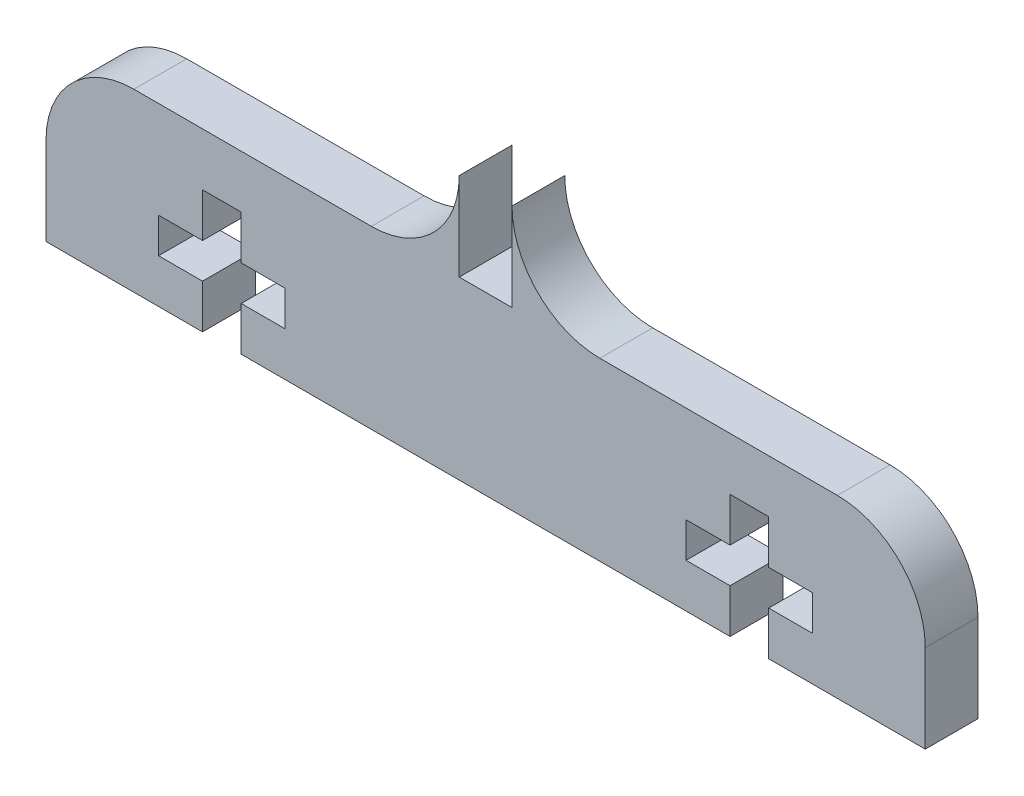
ISO-10303-21;
HEADER;
FILE_DESCRIPTION(('STEP AP214'),'2;1');
FILE_NAME('part.step','',(''),(''),'','','');
FILE_SCHEMA(('AUTOMOTIVE_DESIGN { 1 0 10303 214 1 1 1 1 }'));
ENDSEC;
DATA;
#1=APPLICATION_CONTEXT('core data for automotive mechanical design processes');
#2=APPLICATION_PROTOCOL_DEFINITION('international standard','automotive_design',2000,#1);
#3=PRODUCT_CONTEXT('',#1,'mechanical');
#4=PRODUCT('Part','Part','',(#3));
#5=PRODUCT_RELATED_PRODUCT_CATEGORY('part','',(#4));
#6=PRODUCT_DEFINITION_FORMATION('','',#4);
#7=PRODUCT_DEFINITION_CONTEXT('part definition',#1,'design');
#8=PRODUCT_DEFINITION('design','',#6,#7);
#9=PRODUCT_DEFINITION_SHAPE('','',#8);
#10=(LENGTH_UNIT() NAMED_UNIT(*) SI_UNIT(.MILLI.,.METRE.));
#11=(NAMED_UNIT(*) PLANE_ANGLE_UNIT() SI_UNIT($,.RADIAN.));
#12=(NAMED_UNIT(*) SI_UNIT($,.STERADIAN.) SOLID_ANGLE_UNIT());
#13=UNCERTAINTY_MEASURE_WITH_UNIT(LENGTH_MEASURE(1.E-05),#10,'distance_accuracy_value','');
#14=(GEOMETRIC_REPRESENTATION_CONTEXT(3) GLOBAL_UNCERTAINTY_ASSIGNED_CONTEXT((#13)) GLOBAL_UNIT_ASSIGNED_CONTEXT((#10,
#11,#12)) REPRESENTATION_CONTEXT('',''));
#15=CARTESIAN_POINT('',(0.,0.,0.));
#16=DIRECTION('',(0.,0.,1.));
#17=DIRECTION('',(1.,0.,0.));
#18=AXIS2_PLACEMENT_3D('',#15,#16,#17);
#19=CARTESIAN_POINT('',(6.49999999999999,5.,3.));
#20=DIRECTION('',(0.,-1.,0.));
#21=DIRECTION('',(1.,0.,0.));
#22=AXIS2_PLACEMENT_3D('',#19,#20,#21);
#23=PLANE('',#22);
#24=DIRECTION('',(-1.,0.,0.));
#25=VECTOR('',#24,1.);
#26=CARTESIAN_POINT('',(6.49999999999999,5.,3.));
#27=LINE('',#26,#25);
#28=CARTESIAN_POINT('',(20.,5.,3.));
#29=VERTEX_POINT('',#28);
#30=CARTESIAN_POINT('',(6.49999999999999,5.,3.));
#31=VERTEX_POINT('',#30);
#32=EDGE_CURVE('E264',#29,#31,#27,.T.);
#33=ORIENTED_EDGE('',*,*,#32,.F.);
#34=DIRECTION('',(0.,0.,-1.));
#35=VECTOR('',#34,1.);
#36=CARTESIAN_POINT('',(20.,5.,3.));
#37=LINE('',#36,#35);
#38=CARTESIAN_POINT('',(20.,5.,0.));
#39=VERTEX_POINT('',#38);
#40=EDGE_CURVE('E290',#29,#39,#37,.T.);
#41=ORIENTED_EDGE('',*,*,#40,.T.);
#42=DIRECTION('',(-1.,0.,0.));
#43=VECTOR('',#42,1.);
#44=CARTESIAN_POINT('',(6.49999999999999,5.,0.));
#45=LINE('',#44,#43);
#46=CARTESIAN_POINT('',(6.49999999999999,5.,0.));
#47=VERTEX_POINT('',#46);
#48=EDGE_CURVE('E288',#39,#47,#45,.T.);
#49=ORIENTED_EDGE('',*,*,#48,.T.);
#50=DIRECTION('',(0.,0.,-1.));
#51=VECTOR('',#50,1.);
#52=CARTESIAN_POINT('',(6.49999999999999,5.,3.));
#53=LINE('',#52,#51);
#54=EDGE_CURVE('E281',#31,#47,#53,.T.);
#55=ORIENTED_EDGE('',*,*,#54,.F.);
#56=EDGE_LOOP('',(#33,#41,#49,#55));
#57=FACE_BOUND('',#56,.T.);
#58=ADVANCED_FACE('F33',(#57),#23,.F.);
#59=CARTESIAN_POINT('',(6.49999999999999,10.,3.));
#60=DIRECTION('',(0.,0.,-1.));
#61=DIRECTION('',(-1.,0.,0.));
#62=AXIS2_PLACEMENT_3D('',#59,#60,#61);
#63=CYLINDRICAL_SURFACE('',#62,5.);
#64=CARTESIAN_POINT('',(6.49999999999999,10.,0.));
#65=DIRECTION('',(0.,0.,-1.));
#66=DIRECTION('',(1.,0.,0.));
#67=AXIS2_PLACEMENT_3D('',#64,#65,#66);
#68=CIRCLE('',#67,5.);
#69=CARTESIAN_POINT('',(1.49999999999999,10.,0.));
#70=VERTEX_POINT('',#69);
#71=EDGE_CURVE('E480',#47,#70,#68,.T.);
#72=ORIENTED_EDGE('',*,*,#71,.T.);
#73=DIRECTION('',(0.,0.,-1.));
#74=VECTOR('',#73,1.);
#75=CARTESIAN_POINT('',(1.49999999999999,10.,3.));
#76=LINE('',#75,#74);
#77=CARTESIAN_POINT('',(1.49999999999999,10.,3.));
#78=VERTEX_POINT('',#77);
#79=EDGE_CURVE('E283',#78,#70,#76,.T.);
#80=ORIENTED_EDGE('',*,*,#79,.F.);
#81=CARTESIAN_POINT('',(6.49999999999999,10.,3.));
#82=DIRECTION('',(0.,0.,-1.));
#83=DIRECTION('',(1.,0.,0.));
#84=AXIS2_PLACEMENT_3D('',#81,#82,#83);
#85=CIRCLE('',#84,5.);
#86=EDGE_CURVE('E268',#31,#78,#85,.T.);
#87=ORIENTED_EDGE('',*,*,#86,.F.);
#88=ORIENTED_EDGE('',*,*,#54,.T.);
#89=EDGE_LOOP('',(#72,#80,#87,#88));
#90=FACE_BOUND('',#89,.T.);
#91=ADVANCED_FACE('F280',(#90),#63,.F.);
#92=CARTESIAN_POINT('',(1.49999999999999,10.,3.));
#93=DIRECTION('',(1.,0.,0.));
#94=DIRECTION('',(0.,1.,0.));
#95=AXIS2_PLACEMENT_3D('',#92,#93,#94);
#96=PLANE('',#95);
#97=DIRECTION('',(0.,-1.,0.));
#98=VECTOR('',#97,1.);
#99=CARTESIAN_POINT('',(1.49999999999999,10.,0.));
#100=LINE('',#99,#98);
#101=CARTESIAN_POINT('',(1.49999999999999,5.,0.));
#102=VERTEX_POINT('',#101);
#103=EDGE_CURVE('E475',#70,#102,#100,.T.);
#104=ORIENTED_EDGE('',*,*,#103,.T.);
#105=DIRECTION('',(0.,0.,-1.));
#106=VECTOR('',#105,1.);
#107=CARTESIAN_POINT('',(1.49999999999999,5.,3.));
#108=LINE('',#107,#106);
#109=CARTESIAN_POINT('',(1.49999999999999,5.,3.));
#110=VERTEX_POINT('',#109);
#111=EDGE_CURVE('E294',#110,#102,#108,.T.);
#112=ORIENTED_EDGE('',*,*,#111,.F.);
#113=DIRECTION('',(0.,-1.,0.));
#114=VECTOR('',#113,1.);
#115=CARTESIAN_POINT('',(1.49999999999999,10.,3.));
#116=LINE('',#115,#114);
#117=EDGE_CURVE('E285',#78,#110,#116,.T.);
#118=ORIENTED_EDGE('',*,*,#117,.F.);
#119=ORIENTED_EDGE('',*,*,#79,.T.);
#120=EDGE_LOOP('',(#104,#112,#118,#119));
#121=FACE_BOUND('',#120,.T.);
#122=ADVANCED_FACE('F548',(#121),#96,.F.);
#123=CARTESIAN_POINT('',(-1.5,5.,3.));
#124=DIRECTION('',(0.,-1.,0.));
#125=DIRECTION('',(0.,0.,-1.));
#126=AXIS2_PLACEMENT_3D('',#123,#124,#125);
#127=PLANE('',#126);
#128=DIRECTION('',(-1.,0.,0.));
#129=VECTOR('',#128,1.);
#130=CARTESIAN_POINT('',(-1.5,5.,0.));
#131=LINE('',#130,#129);
#132=CARTESIAN_POINT('',(-1.5,5.,0.));
#133=VERTEX_POINT('',#132);
#134=EDGE_CURVE('E470',#102,#133,#131,.T.);
#135=ORIENTED_EDGE('',*,*,#134,.T.);
#136=DIRECTION('',(0.,0.,-1.));
#137=VECTOR('',#136,1.);
#138=CARTESIAN_POINT('',(-1.5,5.,3.));
#139=LINE('',#138,#137);
#140=CARTESIAN_POINT('',(-1.5,5.,3.));
#141=VERTEX_POINT('',#140);
#142=EDGE_CURVE('E461',#141,#133,#139,.T.);
#143=ORIENTED_EDGE('',*,*,#142,.F.);
#144=DIRECTION('',(-1.,0.,0.));
#145=VECTOR('',#144,1.);
#146=CARTESIAN_POINT('',(-1.5,5.,3.));
#147=LINE('',#146,#145);
#148=EDGE_CURVE('E471',#110,#141,#147,.T.);
#149=ORIENTED_EDGE('',*,*,#148,.F.);
#150=ORIENTED_EDGE('',*,*,#111,.T.);
#151=EDGE_LOOP('',(#135,#143,#149,#150));
#152=FACE_BOUND('',#151,.T.);
#153=ADVANCED_FACE('F468',(#152),#127,.F.);
#154=CARTESIAN_POINT('',(-1.5,10.,3.));
#155=DIRECTION('',(-1.,0.,0.));
#156=DIRECTION('',(0.,-1.,0.));
#157=AXIS2_PLACEMENT_3D('',#154,#155,#156);
#158=PLANE('',#157);
#159=DIRECTION('',(0.,1.,0.));
#160=VECTOR('',#159,1.);
#161=CARTESIAN_POINT('',(-1.5,10.,0.));
#162=LINE('',#161,#160);
#163=CARTESIAN_POINT('',(-1.5,10.,0.));
#164=VERTEX_POINT('',#163);
#165=EDGE_CURVE('E477',#133,#164,#162,.T.);
#166=ORIENTED_EDGE('',*,*,#165,.T.);
#167=DIRECTION('',(0.,0.,-1.));
#168=VECTOR('',#167,1.);
#169=CARTESIAN_POINT('',(-1.5,10.,3.));
#170=LINE('',#169,#168);
#171=CARTESIAN_POINT('',(-1.5,10.,3.));
#172=VERTEX_POINT('',#171);
#173=EDGE_CURVE('E458',#172,#164,#170,.T.);
#174=ORIENTED_EDGE('',*,*,#173,.F.);
#175=DIRECTION('',(0.,1.,0.));
#176=VECTOR('',#175,1.);
#177=CARTESIAN_POINT('',(-1.5,10.,3.));
#178=LINE('',#177,#176);
#179=EDGE_CURVE('E494',#141,#172,#178,.T.);
#180=ORIENTED_EDGE('',*,*,#179,.F.);
#181=ORIENTED_EDGE('',*,*,#142,.T.);
#182=EDGE_LOOP('',(#166,#174,#180,#181));
#183=FACE_BOUND('',#182,.T.);
#184=ADVANCED_FACE('F553',(#183),#158,.F.);
#185=CARTESIAN_POINT('',(-6.5,10.,3.));
#186=DIRECTION('',(0.,0.,-1.));
#187=DIRECTION('',(-1.,0.,0.));
#188=AXIS2_PLACEMENT_3D('',#185,#186,#187);
#189=CYLINDRICAL_SURFACE('',#188,5.);
#190=CARTESIAN_POINT('',(-6.5,10.,0.));
#191=DIRECTION('',(0.,0.,-1.));
#192=DIRECTION('',(-1.,0.,0.));
#193=AXIS2_PLACEMENT_3D('',#190,#191,#192);
#194=CIRCLE('',#193,5.);
#195=CARTESIAN_POINT('',(-6.5,5.,0.));
#196=VERTEX_POINT('',#195);
#197=EDGE_CURVE('E324',#164,#196,#194,.T.);
#198=ORIENTED_EDGE('',*,*,#197,.T.);
#199=DIRECTION('',(0.,0.,-1.));
#200=VECTOR('',#199,1.);
#201=CARTESIAN_POINT('',(-6.5,5.,3.));
#202=LINE('',#201,#200);
#203=CARTESIAN_POINT('',(-6.5,5.,3.));
#204=VERTEX_POINT('',#203);
#205=EDGE_CURVE('E455',#204,#196,#202,.T.);
#206=ORIENTED_EDGE('',*,*,#205,.F.);
#207=CARTESIAN_POINT('',(-6.5,10.,3.));
#208=DIRECTION('',(0.,0.,-1.));
#209=DIRECTION('',(-1.,0.,0.));
#210=AXIS2_PLACEMENT_3D('',#207,#208,#209);
#211=CIRCLE('',#210,5.);
#212=EDGE_CURVE('E490',#172,#204,#211,.T.);
#213=ORIENTED_EDGE('',*,*,#212,.F.);
#214=ORIENTED_EDGE('',*,*,#173,.T.);
#215=EDGE_LOOP('',(#198,#206,#213,#214));
#216=FACE_BOUND('',#215,.T.);
#217=ADVANCED_FACE('F485',(#216),#189,.F.);
#218=CARTESIAN_POINT('',(-25.,5.,3.));
#219=DIRECTION('',(0.,-1.,0.));
#220=DIRECTION('',(1.,0.,0.));
#221=AXIS2_PLACEMENT_3D('',#218,#219,#220);
#222=PLANE('',#221);
#223=DIRECTION('',(-1.,0.,0.));
#224=VECTOR('',#223,1.);
#225=CARTESIAN_POINT('',(-25.,5.,0.));
#226=LINE('',#225,#224);
#227=CARTESIAN_POINT('',(-20.,5.,0.));
#228=VERTEX_POINT('',#227);
#229=EDGE_CURVE('E320',#196,#228,#226,.T.);
#230=ORIENTED_EDGE('',*,*,#229,.T.);
#231=DIRECTION('',(0.,0.,-1.));
#232=VECTOR('',#231,1.);
#233=CARTESIAN_POINT('',(-20.,5.,3.));
#234=LINE('',#233,#232);
#235=CARTESIAN_POINT('',(-20.,5.,3.));
#236=VERTEX_POINT('',#235);
#237=EDGE_CURVE('E11',#228,#236,#234,.F.);
#238=ORIENTED_EDGE('',*,*,#237,.T.);
#239=DIRECTION('',(-1.,0.,0.));
#240=VECTOR('',#239,1.);
#241=CARTESIAN_POINT('',(-25.,5.,3.));
#242=LINE('',#241,#240);
#243=EDGE_CURVE('E489',#204,#236,#242,.T.);
#244=ORIENTED_EDGE('',*,*,#243,.F.);
#245=ORIENTED_EDGE('',*,*,#205,.T.);
#246=EDGE_LOOP('',(#230,#238,#244,#245));
#247=FACE_BOUND('',#246,.T.);
#248=ADVANCED_FACE('F488',(#247),#222,.F.);
#249=CARTESIAN_POINT('',(-25.,-5.,3.));
#250=DIRECTION('',(1.,0.,0.));
#251=DIRECTION('',(0.,0.,-1.));
#252=AXIS2_PLACEMENT_3D('',#249,#250,#251);
#253=PLANE('',#252);
#254=DIRECTION('',(0.,-1.,0.));
#255=VECTOR('',#254,1.);
#256=CARTESIAN_POINT('',(-25.,-5.,3.));
#257=LINE('',#256,#255);
#258=CARTESIAN_POINT('',(-25.,0.,3.));
#259=VERTEX_POINT('',#258);
#260=CARTESIAN_POINT('',(-25.,-5.,3.));
#261=VERTEX_POINT('',#260);
#262=EDGE_CURVE('E312',#259,#261,#257,.T.);
#263=ORIENTED_EDGE('',*,*,#262,.F.);
#264=DIRECTION('',(0.,0.,-1.));
#265=VECTOR('',#264,1.);
#266=CARTESIAN_POINT('',(-25.,0.,3.));
#267=LINE('',#266,#265);
#268=CARTESIAN_POINT('',(-25.,0.,0.));
#269=VERTEX_POINT('',#268);
#270=EDGE_CURVE('E41',#259,#269,#267,.T.);
#271=ORIENTED_EDGE('',*,*,#270,.T.);
#272=DIRECTION('',(0.,-1.,0.));
#273=VECTOR('',#272,1.);
#274=CARTESIAN_POINT('',(-25.,-5.,0.));
#275=LINE('',#274,#273);
#276=CARTESIAN_POINT('',(-25.,-5.,0.));
#277=VERTEX_POINT('',#276);
#278=EDGE_CURVE('E310',#269,#277,#275,.T.);
#279=ORIENTED_EDGE('',*,*,#278,.T.);
#280=DIRECTION('',(0.,0.,-1.));
#281=VECTOR('',#280,1.);
#282=CARTESIAN_POINT('',(-25.,-5.,3.));
#283=LINE('',#282,#281);
#284=EDGE_CURVE('E453',#261,#277,#283,.T.);
#285=ORIENTED_EDGE('',*,*,#284,.F.);
#286=EDGE_LOOP('',(#263,#271,#279,#285));
#287=FACE_BOUND('',#286,.T.);
#288=ADVANCED_FACE('F308',(#287),#253,.F.);
#289=CARTESIAN_POINT('',(-25.,-5.,3.));
#290=DIRECTION('',(0.,1.,0.));
#291=DIRECTION('',(0.,0.,1.));
#292=AXIS2_PLACEMENT_3D('',#289,#290,#291);
#293=PLANE('',#292);
#294=DIRECTION('',(1.,0.,0.));
#295=VECTOR('',#294,1.);
#296=CARTESIAN_POINT('',(-25.,-5.,0.));
#297=LINE('',#296,#295);
#298=CARTESIAN_POINT('',(-16.1,-5.,0.));
#299=VERTEX_POINT('',#298);
#300=EDGE_CURVE('E319',#277,#299,#297,.T.);
#301=ORIENTED_EDGE('',*,*,#300,.T.);
#302=DIRECTION('',(0.,0.,-1.));
#303=VECTOR('',#302,1.);
#304=CARTESIAN_POINT('',(-16.1,-5.,3.));
#305=LINE('',#304,#303);
#306=CARTESIAN_POINT('',(-16.1,-5.,3.));
#307=VERTEX_POINT('',#306);
#308=EDGE_CURVE('E450',#307,#299,#305,.T.);
#309=ORIENTED_EDGE('',*,*,#308,.F.);
#310=DIRECTION('',(1.,0.,0.));
#311=VECTOR('',#310,1.);
#312=CARTESIAN_POINT('',(-25.,-5.,3.));
#313=LINE('',#312,#311);
#314=EDGE_CURVE('E492',#261,#307,#313,.T.);
#315=ORIENTED_EDGE('',*,*,#314,.F.);
#316=ORIENTED_EDGE('',*,*,#284,.T.);
#317=EDGE_LOOP('',(#301,#309,#315,#316));
#318=FACE_BOUND('',#317,.T.);
#319=ADVANCED_FACE('F707',(#318),#293,.F.);
#320=CARTESIAN_POINT('',(-16.1,-5.,3.));
#321=DIRECTION('',(-1.,0.,0.));
#322=DIRECTION('',(0.,-1.,0.));
#323=AXIS2_PLACEMENT_3D('',#320,#321,#322);
#324=PLANE('',#323);
#325=DIRECTION('',(0.,1.,0.));
#326=VECTOR('',#325,1.);
#327=CARTESIAN_POINT('',(-16.1,-5.,0.));
#328=LINE('',#327,#326);
#329=CARTESIAN_POINT('',(-16.1,-2.5,0.));
#330=VERTEX_POINT('',#329);
#331=EDGE_CURVE('E322',#299,#330,#328,.T.);
#332=ORIENTED_EDGE('',*,*,#331,.T.);
#333=DIRECTION('',(0.,0.,-1.));
#334=VECTOR('',#333,1.);
#335=CARTESIAN_POINT('',(-16.1,-2.5,3.));
#336=LINE('',#335,#334);
#337=CARTESIAN_POINT('',(-16.1,-2.5,3.));
#338=VERTEX_POINT('',#337);
#339=EDGE_CURVE('E447',#338,#330,#336,.T.);
#340=ORIENTED_EDGE('',*,*,#339,.F.);
#341=DIRECTION('',(0.,1.,0.));
#342=VECTOR('',#341,1.);
#343=CARTESIAN_POINT('',(-16.1,-5.,3.));
#344=LINE('',#343,#342);
#345=EDGE_CURVE('E499',#307,#338,#344,.T.);
#346=ORIENTED_EDGE('',*,*,#345,.F.);
#347=ORIENTED_EDGE('',*,*,#308,.T.);
#348=EDGE_LOOP('',(#332,#340,#346,#347));
#349=FACE_BOUND('',#348,.T.);
#350=ADVANCED_FACE('F703',(#349),#324,.F.);
#351=CARTESIAN_POINT('',(-16.1,-2.5,3.));
#352=DIRECTION('',(0.,-1.,0.));
#353=DIRECTION('',(1.,0.,0.));
#354=AXIS2_PLACEMENT_3D('',#351,#352,#353);
#355=PLANE('',#354);
#356=DIRECTION('',(-1.,0.,0.));
#357=VECTOR('',#356,1.);
#358=CARTESIAN_POINT('',(-16.1,-2.5,0.));
#359=LINE('',#358,#357);
#360=CARTESIAN_POINT('',(-18.6,-2.5,0.));
#361=VERTEX_POINT('',#360);
#362=EDGE_CURVE('E329',#330,#361,#359,.T.);
#363=ORIENTED_EDGE('',*,*,#362,.T.);
#364=DIRECTION('',(0.,0.,-1.));
#365=VECTOR('',#364,1.);
#366=CARTESIAN_POINT('',(-18.6,-2.5,3.));
#367=LINE('',#366,#365);
#368=CARTESIAN_POINT('',(-18.6,-2.5,3.));
#369=VERTEX_POINT('',#368);
#370=EDGE_CURVE('E444',#369,#361,#367,.T.);
#371=ORIENTED_EDGE('',*,*,#370,.F.);
#372=DIRECTION('',(-1.,0.,0.));
#373=VECTOR('',#372,1.);
#374=CARTESIAN_POINT('',(-16.1,-2.5,3.));
#375=LINE('',#374,#373);
#376=EDGE_CURVE('E501',#338,#369,#375,.T.);
#377=ORIENTED_EDGE('',*,*,#376,.F.);
#378=ORIENTED_EDGE('',*,*,#339,.T.);
#379=EDGE_LOOP('',(#363,#371,#377,#378));
#380=FACE_BOUND('',#379,.T.);
#381=ADVANCED_FACE('F698',(#380),#355,.F.);
#382=CARTESIAN_POINT('',(-18.6,-2.5,3.));
#383=DIRECTION('',(-1.,0.,0.));
#384=DIRECTION('',(0.,0.,1.));
#385=AXIS2_PLACEMENT_3D('',#382,#383,#384);
#386=PLANE('',#385);
#387=DIRECTION('',(0.,1.,0.));
#388=VECTOR('',#387,1.);
#389=CARTESIAN_POINT('',(-18.6,-2.5,0.));
#390=LINE('',#389,#388);
#391=CARTESIAN_POINT('',(-18.6,-0.5,0.));
#392=VERTEX_POINT('',#391);
#393=EDGE_CURVE('E331',#361,#392,#390,.T.);
#394=ORIENTED_EDGE('',*,*,#393,.T.);
#395=DIRECTION('',(0.,0.,-1.));
#396=VECTOR('',#395,1.);
#397=CARTESIAN_POINT('',(-18.6,-0.5,3.));
#398=LINE('',#397,#396);
#399=CARTESIAN_POINT('',(-18.6,-0.5,3.));
#400=VERTEX_POINT('',#399);
#401=EDGE_CURVE('E441',#400,#392,#398,.T.);
#402=ORIENTED_EDGE('',*,*,#401,.F.);
#403=DIRECTION('',(0.,1.,0.));
#404=VECTOR('',#403,1.);
#405=CARTESIAN_POINT('',(-18.6,-2.5,3.));
#406=LINE('',#405,#404);
#407=EDGE_CURVE('E503',#369,#400,#406,.T.);
#408=ORIENTED_EDGE('',*,*,#407,.F.);
#409=ORIENTED_EDGE('',*,*,#370,.T.);
#410=EDGE_LOOP('',(#394,#402,#408,#409));
#411=FACE_BOUND('',#410,.T.);
#412=ADVANCED_FACE('F694',(#411),#386,.F.);
#413=CARTESIAN_POINT('',(-18.6,-0.5,3.));
#414=DIRECTION('',(0.,1.,0.));
#415=DIRECTION('',(-1.,0.,0.));
#416=AXIS2_PLACEMENT_3D('',#413,#414,#415);
#417=PLANE('',#416);
#418=DIRECTION('',(1.,0.,0.));
#419=VECTOR('',#418,1.);
#420=CARTESIAN_POINT('',(-18.6,-0.5,0.));
#421=LINE('',#420,#419);
#422=CARTESIAN_POINT('',(-16.1,-0.5,0.));
#423=VERTEX_POINT('',#422);
#424=EDGE_CURVE('E333',#392,#423,#421,.T.);
#425=ORIENTED_EDGE('',*,*,#424,.T.);
#426=DIRECTION('',(0.,0.,-1.));
#427=VECTOR('',#426,1.);
#428=CARTESIAN_POINT('',(-16.1,-0.5,3.));
#429=LINE('',#428,#427);
#430=CARTESIAN_POINT('',(-16.1,-0.5,3.));
#431=VERTEX_POINT('',#430);
#432=EDGE_CURVE('E438',#431,#423,#429,.T.);
#433=ORIENTED_EDGE('',*,*,#432,.F.);
#434=DIRECTION('',(1.,0.,0.));
#435=VECTOR('',#434,1.);
#436=CARTESIAN_POINT('',(-18.6,-0.5,3.));
#437=LINE('',#436,#435);
#438=EDGE_CURVE('E505',#400,#431,#437,.T.);
#439=ORIENTED_EDGE('',*,*,#438,.F.);
#440=ORIENTED_EDGE('',*,*,#401,.T.);
#441=EDGE_LOOP('',(#425,#433,#439,#440));
#442=FACE_BOUND('',#441,.T.);
#443=ADVANCED_FACE('F690',(#442),#417,.F.);
#444=CARTESIAN_POINT('',(-16.1,-0.5,3.));
#445=DIRECTION('',(-1.,0.,0.));
#446=DIRECTION('',(0.,-1.,0.));
#447=AXIS2_PLACEMENT_3D('',#444,#445,#446);
#448=PLANE('',#447);
#449=DIRECTION('',(0.,1.,0.));
#450=VECTOR('',#449,1.);
#451=CARTESIAN_POINT('',(-16.1,-0.5,0.));
#452=LINE('',#451,#450);
#453=CARTESIAN_POINT('',(-16.1,2.,0.));
#454=VERTEX_POINT('',#453);
#455=EDGE_CURVE('E335',#423,#454,#452,.T.);
#456=ORIENTED_EDGE('',*,*,#455,.T.);
#457=DIRECTION('',(0.,0.,-1.));
#458=VECTOR('',#457,1.);
#459=CARTESIAN_POINT('',(-16.1,2.,3.));
#460=LINE('',#459,#458);
#461=CARTESIAN_POINT('',(-16.1,2.,3.));
#462=VERTEX_POINT('',#461);
#463=EDGE_CURVE('E435',#462,#454,#460,.T.);
#464=ORIENTED_EDGE('',*,*,#463,.F.);
#465=DIRECTION('',(0.,1.,0.));
#466=VECTOR('',#465,1.);
#467=CARTESIAN_POINT('',(-16.1,-0.5,3.));
#468=LINE('',#467,#466);
#469=EDGE_CURVE('E507',#431,#462,#468,.T.);
#470=ORIENTED_EDGE('',*,*,#469,.F.);
#471=ORIENTED_EDGE('',*,*,#432,.T.);
#472=EDGE_LOOP('',(#456,#464,#470,#471));
#473=FACE_BOUND('',#472,.T.);
#474=ADVANCED_FACE('F685',(#473),#448,.F.);
#475=CARTESIAN_POINT('',(-16.1,2.,3.));
#476=DIRECTION('',(0.,1.,0.));
#477=DIRECTION('',(-1.,0.,0.));
#478=AXIS2_PLACEMENT_3D('',#475,#476,#477);
#479=PLANE('',#478);
#480=DIRECTION('',(1.,0.,0.));
#481=VECTOR('',#480,1.);
#482=CARTESIAN_POINT('',(-16.1,2.,0.));
#483=LINE('',#482,#481);
#484=CARTESIAN_POINT('',(-13.9,2.,0.));
#485=VERTEX_POINT('',#484);
#486=EDGE_CURVE('E337',#454,#485,#483,.T.);
#487=ORIENTED_EDGE('',*,*,#486,.T.);
#488=DIRECTION('',(0.,0.,-1.));
#489=VECTOR('',#488,1.);
#490=CARTESIAN_POINT('',(-13.9,2.,3.));
#491=LINE('',#490,#489);
#492=CARTESIAN_POINT('',(-13.9,2.,3.));
#493=VERTEX_POINT('',#492);
#494=EDGE_CURVE('E432',#493,#485,#491,.T.);
#495=ORIENTED_EDGE('',*,*,#494,.F.);
#496=DIRECTION('',(1.,0.,0.));
#497=VECTOR('',#496,1.);
#498=CARTESIAN_POINT('',(-16.1,2.,3.));
#499=LINE('',#498,#497);
#500=EDGE_CURVE('E509',#462,#493,#499,.T.);
#501=ORIENTED_EDGE('',*,*,#500,.F.);
#502=ORIENTED_EDGE('',*,*,#463,.T.);
#503=EDGE_LOOP('',(#487,#495,#501,#502));
#504=FACE_BOUND('',#503,.T.);
#505=ADVANCED_FACE('F679',(#504),#479,.F.);
#506=CARTESIAN_POINT('',(-13.9,2.,3.));
#507=DIRECTION('',(1.,0.,0.));
#508=DIRECTION('',(0.,1.,0.));
#509=AXIS2_PLACEMENT_3D('',#506,#507,#508);
#510=PLANE('',#509);
#511=DIRECTION('',(0.,-1.,0.));
#512=VECTOR('',#511,1.);
#513=CARTESIAN_POINT('',(-13.9,2.,0.));
#514=LINE('',#513,#512);
#515=CARTESIAN_POINT('',(-13.9,-0.5,0.));
#516=VERTEX_POINT('',#515);
#517=EDGE_CURVE('E339',#485,#516,#514,.T.);
#518=ORIENTED_EDGE('',*,*,#517,.T.);
#519=DIRECTION('',(0.,0.,-1.));
#520=VECTOR('',#519,1.);
#521=CARTESIAN_POINT('',(-13.9,-0.5,3.));
#522=LINE('',#521,#520);
#523=CARTESIAN_POINT('',(-13.9,-0.5,3.));
#524=VERTEX_POINT('',#523);
#525=EDGE_CURVE('E429',#524,#516,#522,.T.);
#526=ORIENTED_EDGE('',*,*,#525,.F.);
#527=DIRECTION('',(0.,-1.,0.));
#528=VECTOR('',#527,1.);
#529=CARTESIAN_POINT('',(-13.9,2.,3.));
#530=LINE('',#529,#528);
#531=EDGE_CURVE('E511',#493,#524,#530,.T.);
#532=ORIENTED_EDGE('',*,*,#531,.F.);
#533=ORIENTED_EDGE('',*,*,#494,.T.);
#534=EDGE_LOOP('',(#518,#526,#532,#533));
#535=FACE_BOUND('',#534,.T.);
#536=ADVANCED_FACE('F675',(#535),#510,.F.);
#537=CARTESIAN_POINT('',(-13.9,-0.5,3.));
#538=DIRECTION('',(0.,1.,0.));
#539=DIRECTION('',(-1.,0.,0.));
#540=AXIS2_PLACEMENT_3D('',#537,#538,#539);
#541=PLANE('',#540);
#542=DIRECTION('',(1.,0.,0.));
#543=VECTOR('',#542,1.);
#544=CARTESIAN_POINT('',(-13.9,-0.5,0.));
#545=LINE('',#544,#543);
#546=CARTESIAN_POINT('',(-11.4,-0.5,0.));
#547=VERTEX_POINT('',#546);
#548=EDGE_CURVE('E341',#516,#547,#545,.T.);
#549=ORIENTED_EDGE('',*,*,#548,.T.);
#550=DIRECTION('',(0.,0.,-1.));
#551=VECTOR('',#550,1.);
#552=CARTESIAN_POINT('',(-11.4,-0.5,3.));
#553=LINE('',#552,#551);
#554=CARTESIAN_POINT('',(-11.4,-0.5,3.));
#555=VERTEX_POINT('',#554);
#556=EDGE_CURVE('E426',#555,#547,#553,.T.);
#557=ORIENTED_EDGE('',*,*,#556,.F.);
#558=DIRECTION('',(1.,0.,0.));
#559=VECTOR('',#558,1.);
#560=CARTESIAN_POINT('',(-13.9,-0.5,3.));
#561=LINE('',#560,#559);
#562=EDGE_CURVE('E513',#524,#555,#561,.T.);
#563=ORIENTED_EDGE('',*,*,#562,.F.);
#564=ORIENTED_EDGE('',*,*,#525,.T.);
#565=EDGE_LOOP('',(#549,#557,#563,#564));
#566=FACE_BOUND('',#565,.T.);
#567=ADVANCED_FACE('F670',(#566),#541,.F.);
#568=CARTESIAN_POINT('',(-11.4,-0.5,3.));
#569=DIRECTION('',(1.,0.,0.));
#570=DIRECTION('',(0.,0.,-1.));
#571=AXIS2_PLACEMENT_3D('',#568,#569,#570);
#572=PLANE('',#571);
#573=DIRECTION('',(0.,-1.,0.));
#574=VECTOR('',#573,1.);
#575=CARTESIAN_POINT('',(-11.4,-0.5,0.));
#576=LINE('',#575,#574);
#577=CARTESIAN_POINT('',(-11.4,-2.5,0.));
#578=VERTEX_POINT('',#577);
#579=EDGE_CURVE('E343',#547,#578,#576,.T.);
#580=ORIENTED_EDGE('',*,*,#579,.T.);
#581=DIRECTION('',(0.,0.,-1.));
#582=VECTOR('',#581,1.);
#583=CARTESIAN_POINT('',(-11.4,-2.5,3.));
#584=LINE('',#583,#582);
#585=CARTESIAN_POINT('',(-11.4,-2.5,3.));
#586=VERTEX_POINT('',#585);
#587=EDGE_CURVE('E423',#586,#578,#584,.T.);
#588=ORIENTED_EDGE('',*,*,#587,.F.);
#589=DIRECTION('',(0.,-1.,0.));
#590=VECTOR('',#589,1.);
#591=CARTESIAN_POINT('',(-11.4,-0.5,3.));
#592=LINE('',#591,#590);
#593=EDGE_CURVE('E515',#555,#586,#592,.T.);
#594=ORIENTED_EDGE('',*,*,#593,.F.);
#595=ORIENTED_EDGE('',*,*,#556,.T.);
#596=EDGE_LOOP('',(#580,#588,#594,#595));
#597=FACE_BOUND('',#596,.T.);
#598=ADVANCED_FACE('F664',(#597),#572,.F.);
#599=CARTESIAN_POINT('',(-11.4,-2.5,3.));
#600=DIRECTION('',(0.,-1.,0.));
#601=DIRECTION('',(0.,0.,-1.));
#602=AXIS2_PLACEMENT_3D('',#599,#600,#601);
#603=PLANE('',#602);
#604=DIRECTION('',(-1.,0.,0.));
#605=VECTOR('',#604,1.);
#606=CARTESIAN_POINT('',(-11.4,-2.5,0.));
#607=LINE('',#606,#605);
#608=CARTESIAN_POINT('',(-13.9,-2.5,0.));
#609=VERTEX_POINT('',#608);
#610=EDGE_CURVE('E345',#578,#609,#607,.T.);
#611=ORIENTED_EDGE('',*,*,#610,.T.);
#612=DIRECTION('',(0.,0.,-1.));
#613=VECTOR('',#612,1.);
#614=CARTESIAN_POINT('',(-13.9,-2.5,3.));
#615=LINE('',#614,#613);
#616=CARTESIAN_POINT('',(-13.9,-2.5,3.));
#617=VERTEX_POINT('',#616);
#618=EDGE_CURVE('E420',#617,#609,#615,.T.);
#619=ORIENTED_EDGE('',*,*,#618,.F.);
#620=DIRECTION('',(-1.,0.,0.));
#621=VECTOR('',#620,1.);
#622=CARTESIAN_POINT('',(-11.4,-2.5,3.));
#623=LINE('',#622,#621);
#624=EDGE_CURVE('E517',#586,#617,#623,.T.);
#625=ORIENTED_EDGE('',*,*,#624,.F.);
#626=ORIENTED_EDGE('',*,*,#587,.T.);
#627=EDGE_LOOP('',(#611,#619,#625,#626));
#628=FACE_BOUND('',#627,.T.);
#629=ADVANCED_FACE('F660',(#628),#603,.F.);
#630=CARTESIAN_POINT('',(-13.9,-2.5,3.));
#631=DIRECTION('',(1.,0.,0.));
#632=DIRECTION('',(0.,1.,0.));
#633=AXIS2_PLACEMENT_3D('',#630,#631,#632);
#634=PLANE('',#633);
#635=DIRECTION('',(0.,-1.,0.));
#636=VECTOR('',#635,1.);
#637=CARTESIAN_POINT('',(-13.9,-2.5,0.));
#638=LINE('',#637,#636);
#639=CARTESIAN_POINT('',(-13.9,-5.,0.));
#640=VERTEX_POINT('',#639);
#641=EDGE_CURVE('E347',#609,#640,#638,.T.);
#642=ORIENTED_EDGE('',*,*,#641,.T.);
#643=DIRECTION('',(0.,0.,-1.));
#644=VECTOR('',#643,1.);
#645=CARTESIAN_POINT('',(-13.9,-5.,3.));
#646=LINE('',#645,#644);
#647=CARTESIAN_POINT('',(-13.9,-5.,3.));
#648=VERTEX_POINT('',#647);
#649=EDGE_CURVE('E417',#648,#640,#646,.T.);
#650=ORIENTED_EDGE('',*,*,#649,.F.);
#651=DIRECTION('',(0.,-1.,0.));
#652=VECTOR('',#651,1.);
#653=CARTESIAN_POINT('',(-13.9,-2.5,3.));
#654=LINE('',#653,#652);
#655=EDGE_CURVE('E519',#617,#648,#654,.T.);
#656=ORIENTED_EDGE('',*,*,#655,.F.);
#657=ORIENTED_EDGE('',*,*,#618,.T.);
#658=EDGE_LOOP('',(#642,#650,#656,#657));
#659=FACE_BOUND('',#658,.T.);
#660=ADVANCED_FACE('F655',(#659),#634,.F.);
#661=CARTESIAN_POINT('',(-13.9,-5.,3.));
#662=DIRECTION('',(0.,1.,0.));
#663=DIRECTION('',(0.,0.,1.));
#664=AXIS2_PLACEMENT_3D('',#661,#662,#663);
#665=PLANE('',#664);
#666=DIRECTION('',(1.,0.,0.));
#667=VECTOR('',#666,1.);
#668=CARTESIAN_POINT('',(-13.9,-5.,0.));
#669=LINE('',#668,#667);
#670=CARTESIAN_POINT('',(13.9,-5.,0.));
#671=VERTEX_POINT('',#670);
#672=EDGE_CURVE('E349',#640,#671,#669,.T.);
#673=ORIENTED_EDGE('',*,*,#672,.T.);
#674=DIRECTION('',(0.,0.,-1.));
#675=VECTOR('',#674,1.);
#676=CARTESIAN_POINT('',(13.9,-5.,3.));
#677=LINE('',#676,#675);
#678=CARTESIAN_POINT('',(13.9,-5.,3.));
#679=VERTEX_POINT('',#678);
#680=EDGE_CURVE('E414',#679,#671,#677,.T.);
#681=ORIENTED_EDGE('',*,*,#680,.F.);
#682=DIRECTION('',(1.,0.,0.));
#683=VECTOR('',#682,1.);
#684=CARTESIAN_POINT('',(-13.9,-5.,3.));
#685=LINE('',#684,#683);
#686=EDGE_CURVE('E521',#648,#679,#685,.T.);
#687=ORIENTED_EDGE('',*,*,#686,.F.);
#688=ORIENTED_EDGE('',*,*,#649,.T.);
#689=EDGE_LOOP('',(#673,#681,#687,#688));
#690=FACE_BOUND('',#689,.T.);
#691=ADVANCED_FACE('F649',(#690),#665,.F.);
#692=CARTESIAN_POINT('',(13.9,-2.5,3.));
#693=DIRECTION('',(-1.,0.,0.));
#694=DIRECTION('',(0.,-1.,0.));
#695=AXIS2_PLACEMENT_3D('',#692,#693,#694);
#696=PLANE('',#695);
#697=DIRECTION('',(0.,1.,0.));
#698=VECTOR('',#697,1.);
#699=CARTESIAN_POINT('',(13.9,-2.5,0.));
#700=LINE('',#699,#698);
#701=CARTESIAN_POINT('',(13.9,-2.5,0.));
#702=VERTEX_POINT('',#701);
#703=EDGE_CURVE('E351',#671,#702,#700,.T.);
#704=ORIENTED_EDGE('',*,*,#703,.T.);
#705=DIRECTION('',(0.,0.,-1.));
#706=VECTOR('',#705,1.);
#707=CARTESIAN_POINT('',(13.9,-2.5,3.));
#708=LINE('',#707,#706);
#709=CARTESIAN_POINT('',(13.9,-2.5,3.));
#710=VERTEX_POINT('',#709);
#711=EDGE_CURVE('E411',#710,#702,#708,.T.);
#712=ORIENTED_EDGE('',*,*,#711,.F.);
#713=DIRECTION('',(0.,1.,0.));
#714=VECTOR('',#713,1.);
#715=CARTESIAN_POINT('',(13.9,-2.5,3.));
#716=LINE('',#715,#714);
#717=EDGE_CURVE('E523',#679,#710,#716,.T.);
#718=ORIENTED_EDGE('',*,*,#717,.F.);
#719=ORIENTED_EDGE('',*,*,#680,.T.);
#720=EDGE_LOOP('',(#704,#712,#718,#719));
#721=FACE_BOUND('',#720,.T.);
#722=ADVANCED_FACE('F645',(#721),#696,.F.);
#723=CARTESIAN_POINT('',(11.4,-2.5,3.));
#724=DIRECTION('',(0.,-1.,0.));
#725=DIRECTION('',(0.,0.,-1.));
#726=AXIS2_PLACEMENT_3D('',#723,#724,#725);
#727=PLANE('',#726);
#728=DIRECTION('',(-1.,0.,0.));
#729=VECTOR('',#728,1.);
#730=CARTESIAN_POINT('',(11.4,-2.5,0.));
#731=LINE('',#730,#729);
#732=CARTESIAN_POINT('',(11.4,-2.5,0.));
#733=VERTEX_POINT('',#732);
#734=EDGE_CURVE('E353',#702,#733,#731,.T.);
#735=ORIENTED_EDGE('',*,*,#734,.T.);
#736=DIRECTION('',(0.,0.,-1.));
#737=VECTOR('',#736,1.);
#738=CARTESIAN_POINT('',(11.4,-2.5,3.));
#739=LINE('',#738,#737);
#740=CARTESIAN_POINT('',(11.4,-2.5,3.));
#741=VERTEX_POINT('',#740);
#742=EDGE_CURVE('E408',#741,#733,#739,.T.);
#743=ORIENTED_EDGE('',*,*,#742,.F.);
#744=DIRECTION('',(-1.,0.,0.));
#745=VECTOR('',#744,1.);
#746=CARTESIAN_POINT('',(11.4,-2.5,3.));
#747=LINE('',#746,#745);
#748=EDGE_CURVE('E525',#710,#741,#747,.T.);
#749=ORIENTED_EDGE('',*,*,#748,.F.);
#750=ORIENTED_EDGE('',*,*,#711,.T.);
#751=EDGE_LOOP('',(#735,#743,#749,#750));
#752=FACE_BOUND('',#751,.T.);
#753=ADVANCED_FACE('F640',(#752),#727,.F.);
#754=CARTESIAN_POINT('',(11.4,-0.5,3.));
#755=DIRECTION('',(-1.,0.,0.));
#756=DIRECTION('',(0.,0.,1.));
#757=AXIS2_PLACEMENT_3D('',#754,#755,#756);
#758=PLANE('',#757);
#759=DIRECTION('',(0.,1.,0.));
#760=VECTOR('',#759,1.);
#761=CARTESIAN_POINT('',(11.4,-0.5,0.));
#762=LINE('',#761,#760);
#763=CARTESIAN_POINT('',(11.4,-0.5,0.));
#764=VERTEX_POINT('',#763);
#765=EDGE_CURVE('E355',#733,#764,#762,.T.);
#766=ORIENTED_EDGE('',*,*,#765,.T.);
#767=DIRECTION('',(0.,0.,-1.));
#768=VECTOR('',#767,1.);
#769=CARTESIAN_POINT('',(11.4,-0.5,3.));
#770=LINE('',#769,#768);
#771=CARTESIAN_POINT('',(11.4,-0.5,3.));
#772=VERTEX_POINT('',#771);
#773=EDGE_CURVE('E405',#772,#764,#770,.T.);
#774=ORIENTED_EDGE('',*,*,#773,.F.);
#775=DIRECTION('',(0.,1.,0.));
#776=VECTOR('',#775,1.);
#777=CARTESIAN_POINT('',(11.4,-0.5,3.));
#778=LINE('',#777,#776);
#779=EDGE_CURVE('E527',#741,#772,#778,.T.);
#780=ORIENTED_EDGE('',*,*,#779,.F.);
#781=ORIENTED_EDGE('',*,*,#742,.T.);
#782=EDGE_LOOP('',(#766,#774,#780,#781));
#783=FACE_BOUND('',#782,.T.);
#784=ADVANCED_FACE('F634',(#783),#758,.F.);
#785=CARTESIAN_POINT('',(13.9,-0.5,3.));
#786=DIRECTION('',(0.,1.,0.));
#787=DIRECTION('',(-1.,0.,0.));
#788=AXIS2_PLACEMENT_3D('',#785,#786,#787);
#789=PLANE('',#788);
#790=DIRECTION('',(1.,0.,0.));
#791=VECTOR('',#790,1.);
#792=CARTESIAN_POINT('',(13.9,-0.5,0.));
#793=LINE('',#792,#791);
#794=CARTESIAN_POINT('',(13.9,-0.5,0.));
#795=VERTEX_POINT('',#794);
#796=EDGE_CURVE('E357',#764,#795,#793,.T.);
#797=ORIENTED_EDGE('',*,*,#796,.T.);
#798=DIRECTION('',(0.,0.,-1.));
#799=VECTOR('',#798,1.);
#800=CARTESIAN_POINT('',(13.9,-0.5,3.));
#801=LINE('',#800,#799);
#802=CARTESIAN_POINT('',(13.9,-0.5,3.));
#803=VERTEX_POINT('',#802);
#804=EDGE_CURVE('E402',#803,#795,#801,.T.);
#805=ORIENTED_EDGE('',*,*,#804,.F.);
#806=DIRECTION('',(1.,0.,0.));
#807=VECTOR('',#806,1.);
#808=CARTESIAN_POINT('',(13.9,-0.5,3.));
#809=LINE('',#808,#807);
#810=EDGE_CURVE('E529',#772,#803,#809,.T.);
#811=ORIENTED_EDGE('',*,*,#810,.F.);
#812=ORIENTED_EDGE('',*,*,#773,.T.);
#813=EDGE_LOOP('',(#797,#805,#811,#812));
#814=FACE_BOUND('',#813,.T.);
#815=ADVANCED_FACE('F630',(#814),#789,.F.);
#816=CARTESIAN_POINT('',(13.9,2.,3.));
#817=DIRECTION('',(-1.,0.,0.));
#818=DIRECTION('',(0.,-1.,0.));
#819=AXIS2_PLACEMENT_3D('',#816,#817,#818);
#820=PLANE('',#819);
#821=DIRECTION('',(0.,1.,0.));
#822=VECTOR('',#821,1.);
#823=CARTESIAN_POINT('',(13.9,2.,0.));
#824=LINE('',#823,#822);
#825=CARTESIAN_POINT('',(13.9,2.,0.));
#826=VERTEX_POINT('',#825);
#827=EDGE_CURVE('E359',#795,#826,#824,.T.);
#828=ORIENTED_EDGE('',*,*,#827,.T.);
#829=DIRECTION('',(0.,0.,-1.));
#830=VECTOR('',#829,1.);
#831=CARTESIAN_POINT('',(13.9,2.,3.));
#832=LINE('',#831,#830);
#833=CARTESIAN_POINT('',(13.9,2.,3.));
#834=VERTEX_POINT('',#833);
#835=EDGE_CURVE('E399',#834,#826,#832,.T.);
#836=ORIENTED_EDGE('',*,*,#835,.F.);
#837=DIRECTION('',(0.,1.,0.));
#838=VECTOR('',#837,1.);
#839=CARTESIAN_POINT('',(13.9,2.,3.));
#840=LINE('',#839,#838);
#841=EDGE_CURVE('E531',#803,#834,#840,.T.);
#842=ORIENTED_EDGE('',*,*,#841,.F.);
#843=ORIENTED_EDGE('',*,*,#804,.T.);
#844=EDGE_LOOP('',(#828,#836,#842,#843));
#845=FACE_BOUND('',#844,.T.);
#846=ADVANCED_FACE('F625',(#845),#820,.F.);
#847=CARTESIAN_POINT('',(16.1,2.,3.));
#848=DIRECTION('',(0.,1.,0.));
#849=DIRECTION('',(-1.,0.,0.));
#850=AXIS2_PLACEMENT_3D('',#847,#848,#849);
#851=PLANE('',#850);
#852=DIRECTION('',(1.,0.,0.));
#853=VECTOR('',#852,1.);
#854=CARTESIAN_POINT('',(16.1,2.,0.));
#855=LINE('',#854,#853);
#856=CARTESIAN_POINT('',(16.1,2.,0.));
#857=VERTEX_POINT('',#856);
#858=EDGE_CURVE('E361',#826,#857,#855,.T.);
#859=ORIENTED_EDGE('',*,*,#858,.T.);
#860=DIRECTION('',(0.,0.,-1.));
#861=VECTOR('',#860,1.);
#862=CARTESIAN_POINT('',(16.1,2.,3.));
#863=LINE('',#862,#861);
#864=CARTESIAN_POINT('',(16.1,2.,3.));
#865=VERTEX_POINT('',#864);
#866=EDGE_CURVE('E396',#865,#857,#863,.T.);
#867=ORIENTED_EDGE('',*,*,#866,.F.);
#868=DIRECTION('',(1.,0.,0.));
#869=VECTOR('',#868,1.);
#870=CARTESIAN_POINT('',(16.1,2.,3.));
#871=LINE('',#870,#869);
#872=EDGE_CURVE('E533',#834,#865,#871,.T.);
#873=ORIENTED_EDGE('',*,*,#872,.F.);
#874=ORIENTED_EDGE('',*,*,#835,.T.);
#875=EDGE_LOOP('',(#859,#867,#873,#874));
#876=FACE_BOUND('',#875,.T.);
#877=ADVANCED_FACE('F619',(#876),#851,.F.);
#878=CARTESIAN_POINT('',(16.1,-0.5,3.));
#879=DIRECTION('',(1.,0.,0.));
#880=DIRECTION('',(0.,1.,0.));
#881=AXIS2_PLACEMENT_3D('',#878,#879,#880);
#882=PLANE('',#881);
#883=DIRECTION('',(0.,-1.,0.));
#884=VECTOR('',#883,1.);
#885=CARTESIAN_POINT('',(16.1,-0.5,0.));
#886=LINE('',#885,#884);
#887=CARTESIAN_POINT('',(16.1,-0.5,0.));
#888=VERTEX_POINT('',#887);
#889=EDGE_CURVE('E363',#857,#888,#886,.T.);
#890=ORIENTED_EDGE('',*,*,#889,.T.);
#891=DIRECTION('',(0.,0.,-1.));
#892=VECTOR('',#891,1.);
#893=CARTESIAN_POINT('',(16.1,-0.5,3.));
#894=LINE('',#893,#892);
#895=CARTESIAN_POINT('',(16.1,-0.5,3.));
#896=VERTEX_POINT('',#895);
#897=EDGE_CURVE('E393',#896,#888,#894,.T.);
#898=ORIENTED_EDGE('',*,*,#897,.F.);
#899=DIRECTION('',(0.,-1.,0.));
#900=VECTOR('',#899,1.);
#901=CARTESIAN_POINT('',(16.1,-0.5,3.));
#902=LINE('',#901,#900);
#903=EDGE_CURVE('E535',#865,#896,#902,.T.);
#904=ORIENTED_EDGE('',*,*,#903,.F.);
#905=ORIENTED_EDGE('',*,*,#866,.T.);
#906=EDGE_LOOP('',(#890,#898,#904,#905));
#907=FACE_BOUND('',#906,.T.);
#908=ADVANCED_FACE('F615',(#907),#882,.F.);
#909=CARTESIAN_POINT('',(18.6,-0.5,3.));
#910=DIRECTION('',(0.,1.,0.));
#911=DIRECTION('',(-1.,0.,0.));
#912=AXIS2_PLACEMENT_3D('',#909,#910,#911);
#913=PLANE('',#912);
#914=DIRECTION('',(1.,0.,0.));
#915=VECTOR('',#914,1.);
#916=CARTESIAN_POINT('',(18.6,-0.5,0.));
#917=LINE('',#916,#915);
#918=CARTESIAN_POINT('',(18.6,-0.5,0.));
#919=VERTEX_POINT('',#918);
#920=EDGE_CURVE('E365',#888,#919,#917,.T.);
#921=ORIENTED_EDGE('',*,*,#920,.T.);
#922=DIRECTION('',(0.,0.,-1.));
#923=VECTOR('',#922,1.);
#924=CARTESIAN_POINT('',(18.6,-0.5,3.));
#925=LINE('',#924,#923);
#926=CARTESIAN_POINT('',(18.6,-0.5,3.));
#927=VERTEX_POINT('',#926);
#928=EDGE_CURVE('E390',#927,#919,#925,.T.);
#929=ORIENTED_EDGE('',*,*,#928,.F.);
#930=DIRECTION('',(1.,0.,0.));
#931=VECTOR('',#930,1.);
#932=CARTESIAN_POINT('',(18.6,-0.5,3.));
#933=LINE('',#932,#931);
#934=EDGE_CURVE('E537',#896,#927,#933,.T.);
#935=ORIENTED_EDGE('',*,*,#934,.F.);
#936=ORIENTED_EDGE('',*,*,#897,.T.);
#937=EDGE_LOOP('',(#921,#929,#935,#936));
#938=FACE_BOUND('',#937,.T.);
#939=ADVANCED_FACE('F610',(#938),#913,.F.);
#940=CARTESIAN_POINT('',(18.6,-2.5,3.));
#941=DIRECTION('',(1.,0.,0.));
#942=DIRECTION('',(0.,0.,-1.));
#943=AXIS2_PLACEMENT_3D('',#940,#941,#942);
#944=PLANE('',#943);
#945=DIRECTION('',(0.,-1.,0.));
#946=VECTOR('',#945,1.);
#947=CARTESIAN_POINT('',(18.6,-2.5,0.));
#948=LINE('',#947,#946);
#949=CARTESIAN_POINT('',(18.6,-2.5,0.));
#950=VERTEX_POINT('',#949);
#951=EDGE_CURVE('E367',#919,#950,#948,.T.);
#952=ORIENTED_EDGE('',*,*,#951,.T.);
#953=DIRECTION('',(0.,0.,-1.));
#954=VECTOR('',#953,1.);
#955=CARTESIAN_POINT('',(18.6,-2.5,3.));
#956=LINE('',#955,#954);
#957=CARTESIAN_POINT('',(18.6,-2.5,3.));
#958=VERTEX_POINT('',#957);
#959=EDGE_CURVE('E387',#958,#950,#956,.T.);
#960=ORIENTED_EDGE('',*,*,#959,.F.);
#961=DIRECTION('',(0.,-1.,0.));
#962=VECTOR('',#961,1.);
#963=CARTESIAN_POINT('',(18.6,-2.5,3.));
#964=LINE('',#963,#962);
#965=EDGE_CURVE('E539',#927,#958,#964,.T.);
#966=ORIENTED_EDGE('',*,*,#965,.F.);
#967=ORIENTED_EDGE('',*,*,#928,.T.);
#968=EDGE_LOOP('',(#952,#960,#966,#967));
#969=FACE_BOUND('',#968,.T.);
#970=ADVANCED_FACE('F604',(#969),#944,.F.);
#971=CARTESIAN_POINT('',(16.1,-2.5,3.));
#972=DIRECTION('',(0.,-1.,0.));
#973=DIRECTION('',(1.,0.,0.));
#974=AXIS2_PLACEMENT_3D('',#971,#972,#973);
#975=PLANE('',#974);
#976=DIRECTION('',(-1.,0.,0.));
#977=VECTOR('',#976,1.);
#978=CARTESIAN_POINT('',(16.1,-2.5,0.));
#979=LINE('',#978,#977);
#980=CARTESIAN_POINT('',(16.1,-2.5,0.));
#981=VERTEX_POINT('',#980);
#982=EDGE_CURVE('E369',#950,#981,#979,.T.);
#983=ORIENTED_EDGE('',*,*,#982,.T.);
#984=DIRECTION('',(0.,0.,-1.));
#985=VECTOR('',#984,1.);
#986=CARTESIAN_POINT('',(16.1,-2.5,3.));
#987=LINE('',#986,#985);
#988=CARTESIAN_POINT('',(16.1,-2.5,3.));
#989=VERTEX_POINT('',#988);
#990=EDGE_CURVE('E384',#989,#981,#987,.T.);
#991=ORIENTED_EDGE('',*,*,#990,.F.);
#992=DIRECTION('',(-1.,0.,0.));
#993=VECTOR('',#992,1.);
#994=CARTESIAN_POINT('',(16.1,-2.5,3.));
#995=LINE('',#994,#993);
#996=EDGE_CURVE('E541',#958,#989,#995,.T.);
#997=ORIENTED_EDGE('',*,*,#996,.F.);
#998=ORIENTED_EDGE('',*,*,#959,.T.);
#999=EDGE_LOOP('',(#983,#991,#997,#998));
#1000=FACE_BOUND('',#999,.T.);
#1001=ADVANCED_FACE('F600',(#1000),#975,.F.);
#1002=CARTESIAN_POINT('',(16.1,-5.,3.));
#1003=DIRECTION('',(1.,0.,0.));
#1004=DIRECTION('',(0.,1.,0.));
#1005=AXIS2_PLACEMENT_3D('',#1002,#1003,#1004);
#1006=PLANE('',#1005);
#1007=DIRECTION('',(0.,-1.,0.));
#1008=VECTOR('',#1007,1.);
#1009=CARTESIAN_POINT('',(16.1,-5.,0.));
#1010=LINE('',#1009,#1008);
#1011=CARTESIAN_POINT('',(16.1,-5.,0.));
#1012=VERTEX_POINT('',#1011);
#1013=EDGE_CURVE('E371',#981,#1012,#1010,.T.);
#1014=ORIENTED_EDGE('',*,*,#1013,.T.);
#1015=DIRECTION('',(0.,0.,-1.));
#1016=VECTOR('',#1015,1.);
#1017=CARTESIAN_POINT('',(16.1,-5.,3.));
#1018=LINE('',#1017,#1016);
#1019=CARTESIAN_POINT('',(16.1,-5.,3.));
#1020=VERTEX_POINT('',#1019);
#1021=EDGE_CURVE('E380',#1020,#1012,#1018,.T.);
#1022=ORIENTED_EDGE('',*,*,#1021,.F.);
#1023=DIRECTION('',(0.,-1.,0.));
#1024=VECTOR('',#1023,1.);
#1025=CARTESIAN_POINT('',(16.1,-5.,3.));
#1026=LINE('',#1025,#1024);
#1027=EDGE_CURVE('E543',#989,#1020,#1026,.T.);
#1028=ORIENTED_EDGE('',*,*,#1027,.F.);
#1029=ORIENTED_EDGE('',*,*,#990,.T.);
#1030=EDGE_LOOP('',(#1014,#1022,#1028,#1029));
#1031=FACE_BOUND('',#1030,.T.);
#1032=ADVANCED_FACE('F595',(#1031),#1006,.F.);
#1033=CARTESIAN_POINT('',(16.1,-5.,3.));
#1034=DIRECTION('',(0.,1.,0.));
#1035=DIRECTION('',(0.,0.,1.));
#1036=AXIS2_PLACEMENT_3D('',#1033,#1034,#1035);
#1037=PLANE('',#1036);
#1038=DIRECTION('',(1.,0.,0.));
#1039=VECTOR('',#1038,1.);
#1040=CARTESIAN_POINT('',(16.1,-5.,0.));
#1041=LINE('',#1040,#1039);
#1042=CARTESIAN_POINT('',(25.,-5.,0.));
#1043=VERTEX_POINT('',#1042);
#1044=EDGE_CURVE('E373',#1012,#1043,#1041,.T.);
#1045=ORIENTED_EDGE('',*,*,#1044,.T.);
#1046=DIRECTION('',(0.,0.,-1.));
#1047=VECTOR('',#1046,1.);
#1048=CARTESIAN_POINT('',(25.,-5.,3.));
#1049=LINE('',#1048,#1047);
#1050=CARTESIAN_POINT('',(25.,-5.,3.));
#1051=VERTEX_POINT('',#1050);
#1052=EDGE_CURVE('E377',#1051,#1043,#1049,.T.);
#1053=ORIENTED_EDGE('',*,*,#1052,.F.);
#1054=DIRECTION('',(1.,0.,0.));
#1055=VECTOR('',#1054,1.);
#1056=CARTESIAN_POINT('',(16.1,-5.,3.));
#1057=LINE('',#1056,#1055);
#1058=EDGE_CURVE('E545',#1020,#1051,#1057,.T.);
#1059=ORIENTED_EDGE('',*,*,#1058,.F.);
#1060=ORIENTED_EDGE('',*,*,#1021,.T.);
#1061=EDGE_LOOP('',(#1045,#1053,#1059,#1060));
#1062=FACE_BOUND('',#1061,.T.);
#1063=ADVANCED_FACE('F589',(#1062),#1037,.F.);
#1064=CARTESIAN_POINT('',(25.,-5.,3.));
#1065=DIRECTION('',(-1.,0.,0.));
#1066=DIRECTION('',(0.,0.,1.));
#1067=AXIS2_PLACEMENT_3D('',#1064,#1065,#1066);
#1068=PLANE('',#1067);
#1069=DIRECTION('',(0.,1.,0.));
#1070=VECTOR('',#1069,1.);
#1071=CARTESIAN_POINT('',(25.,-5.,0.));
#1072=LINE('',#1071,#1070);
#1073=CARTESIAN_POINT('',(25.,0.,0.));
#1074=VERTEX_POINT('',#1073);
#1075=EDGE_CURVE('E276',#1043,#1074,#1072,.T.);
#1076=ORIENTED_EDGE('',*,*,#1075,.T.);
#1077=DIRECTION('',(0.,0.,-1.));
#1078=VECTOR('',#1077,1.);
#1079=CARTESIAN_POINT('',(25.,0.,3.));
#1080=LINE('',#1079,#1078);
#1081=CARTESIAN_POINT('',(25.,0.,3.));
#1082=VERTEX_POINT('',#1081);
#1083=EDGE_CURVE('E301',#1074,#1082,#1080,.F.);
#1084=ORIENTED_EDGE('',*,*,#1083,.T.);
#1085=DIRECTION('',(0.,1.,0.));
#1086=VECTOR('',#1085,1.);
#1087=CARTESIAN_POINT('',(25.,-5.,3.));
#1088=LINE('',#1087,#1086);
#1089=EDGE_CURVE('E381',#1051,#1082,#1088,.T.);
#1090=ORIENTED_EDGE('',*,*,#1089,.F.);
#1091=ORIENTED_EDGE('',*,*,#1052,.T.);
#1092=EDGE_LOOP('',(#1076,#1084,#1090,#1091));
#1093=FACE_BOUND('',#1092,.T.);
#1094=ADVANCED_FACE('F584',(#1093),#1068,.F.);
#1095=CARTESIAN_POINT('',(-6.5,10.,3.));
#1096=DIRECTION('',(0.,0.,-1.));
#1097=DIRECTION('',(-1.,0.,0.));
#1098=AXIS2_PLACEMENT_3D('',#1095,#1096,#1097);
#1099=PLANE('',#1098);
#1100=ORIENTED_EDGE('',*,*,#1089,.T.);
#1101=CARTESIAN_POINT('',(20.,0.,3.));
#1102=DIRECTION('',(0.,0.,-1.));
#1103=DIRECTION('',(-1.,0.,0.));
#1104=AXIS2_PLACEMENT_3D('',#1101,#1102,#1103);
#1105=CIRCLE('',#1104,5.);
#1106=EDGE_CURVE('E271',#1082,#29,#1105,.F.);
#1107=ORIENTED_EDGE('',*,*,#1106,.T.);
#1108=ORIENTED_EDGE('',*,*,#32,.T.);
#1109=ORIENTED_EDGE('',*,*,#86,.T.);
#1110=ORIENTED_EDGE('',*,*,#117,.T.);
#1111=ORIENTED_EDGE('',*,*,#148,.T.);
#1112=ORIENTED_EDGE('',*,*,#179,.T.);
#1113=ORIENTED_EDGE('',*,*,#212,.T.);
#1114=ORIENTED_EDGE('',*,*,#243,.T.);
#1115=CARTESIAN_POINT('',(-20.,0.,3.));
#1116=DIRECTION('',(0.,0.,-1.));
#1117=DIRECTION('',(-1.,0.,0.));
#1118=AXIS2_PLACEMENT_3D('',#1115,#1116,#1117);
#1119=CIRCLE('',#1118,5.);
#1120=EDGE_CURVE('E48',#236,#259,#1119,.F.);
#1121=ORIENTED_EDGE('',*,*,#1120,.T.);
#1122=ORIENTED_EDGE('',*,*,#262,.T.);
#1123=ORIENTED_EDGE('',*,*,#314,.T.);
#1124=ORIENTED_EDGE('',*,*,#345,.T.);
#1125=ORIENTED_EDGE('',*,*,#376,.T.);
#1126=ORIENTED_EDGE('',*,*,#407,.T.);
#1127=ORIENTED_EDGE('',*,*,#438,.T.);
#1128=ORIENTED_EDGE('',*,*,#469,.T.);
#1129=ORIENTED_EDGE('',*,*,#500,.T.);
#1130=ORIENTED_EDGE('',*,*,#531,.T.);
#1131=ORIENTED_EDGE('',*,*,#562,.T.);
#1132=ORIENTED_EDGE('',*,*,#593,.T.);
#1133=ORIENTED_EDGE('',*,*,#624,.T.);
#1134=ORIENTED_EDGE('',*,*,#655,.T.);
#1135=ORIENTED_EDGE('',*,*,#686,.T.);
#1136=ORIENTED_EDGE('',*,*,#717,.T.);
#1137=ORIENTED_EDGE('',*,*,#748,.T.);
#1138=ORIENTED_EDGE('',*,*,#779,.T.);
#1139=ORIENTED_EDGE('',*,*,#810,.T.);
#1140=ORIENTED_EDGE('',*,*,#841,.T.);
#1141=ORIENTED_EDGE('',*,*,#872,.T.);
#1142=ORIENTED_EDGE('',*,*,#903,.T.);
#1143=ORIENTED_EDGE('',*,*,#934,.T.);
#1144=ORIENTED_EDGE('',*,*,#965,.T.);
#1145=ORIENTED_EDGE('',*,*,#996,.T.);
#1146=ORIENTED_EDGE('',*,*,#1027,.T.);
#1147=ORIENTED_EDGE('',*,*,#1058,.T.);
#1148=EDGE_LOOP('',(#1100,#1107,#1108,#1109,#1110,#1111,#1112,#1113,#1114,#1121,#1122,#1123,
#1124,#1125,#1126,#1127,#1128,#1129,#1130,#1131,#1132,#1133,#1134,#1135,#1136,#1137,#1138,#1139,
#1140,#1141,#1142,#1143,#1144,#1145,#1146,#1147));
#1149=FACE_BOUND('',#1148,.T.);
#1150=ADVANCED_FACE('F267',(#1149),#1099,.F.);
#1151=CARTESIAN_POINT('',(-6.5,10.,0.));
#1152=DIRECTION('',(0.,0.,-1.));
#1153=DIRECTION('',(-1.,0.,0.));
#1154=AXIS2_PLACEMENT_3D('',#1151,#1152,#1153);
#1155=PLANE('',#1154);
#1156=ORIENTED_EDGE('',*,*,#48,.F.);
#1157=CARTESIAN_POINT('',(20.,0.,0.));
#1158=DIRECTION('',(0.,0.,-1.));
#1159=DIRECTION('',(-1.,0.,0.));
#1160=AXIS2_PLACEMENT_3D('',#1157,#1158,#1159);
#1161=CIRCLE('',#1160,5.);
#1162=EDGE_CURVE('E299',#39,#1074,#1161,.T.);
#1163=ORIENTED_EDGE('',*,*,#1162,.T.);
#1164=ORIENTED_EDGE('',*,*,#1075,.F.);
#1165=ORIENTED_EDGE('',*,*,#1044,.F.);
#1166=ORIENTED_EDGE('',*,*,#1013,.F.);
#1167=ORIENTED_EDGE('',*,*,#982,.F.);
#1168=ORIENTED_EDGE('',*,*,#951,.F.);
#1169=ORIENTED_EDGE('',*,*,#920,.F.);
#1170=ORIENTED_EDGE('',*,*,#889,.F.);
#1171=ORIENTED_EDGE('',*,*,#858,.F.);
#1172=ORIENTED_EDGE('',*,*,#827,.F.);
#1173=ORIENTED_EDGE('',*,*,#796,.F.);
#1174=ORIENTED_EDGE('',*,*,#765,.F.);
#1175=ORIENTED_EDGE('',*,*,#734,.F.);
#1176=ORIENTED_EDGE('',*,*,#703,.F.);
#1177=ORIENTED_EDGE('',*,*,#672,.F.);
#1178=ORIENTED_EDGE('',*,*,#641,.F.);
#1179=ORIENTED_EDGE('',*,*,#610,.F.);
#1180=ORIENTED_EDGE('',*,*,#579,.F.);
#1181=ORIENTED_EDGE('',*,*,#548,.F.);
#1182=ORIENTED_EDGE('',*,*,#517,.F.);
#1183=ORIENTED_EDGE('',*,*,#486,.F.);
#1184=ORIENTED_EDGE('',*,*,#455,.F.);
#1185=ORIENTED_EDGE('',*,*,#424,.F.);
#1186=ORIENTED_EDGE('',*,*,#393,.F.);
#1187=ORIENTED_EDGE('',*,*,#362,.F.);
#1188=ORIENTED_EDGE('',*,*,#331,.F.);
#1189=ORIENTED_EDGE('',*,*,#300,.F.);
#1190=ORIENTED_EDGE('',*,*,#278,.F.);
#1191=CARTESIAN_POINT('',(-20.,0.,0.));
#1192=DIRECTION('',(0.,0.,-1.));
#1193=DIRECTION('',(-1.,0.,0.));
#1194=AXIS2_PLACEMENT_3D('',#1191,#1192,#1193);
#1195=CIRCLE('',#1194,5.);
#1196=EDGE_CURVE('E292',#269,#228,#1195,.T.);
#1197=ORIENTED_EDGE('',*,*,#1196,.T.);
#1198=ORIENTED_EDGE('',*,*,#229,.F.);
#1199=ORIENTED_EDGE('',*,*,#197,.F.);
#1200=ORIENTED_EDGE('',*,*,#165,.F.);
#1201=ORIENTED_EDGE('',*,*,#134,.F.);
#1202=ORIENTED_EDGE('',*,*,#103,.F.);
#1203=ORIENTED_EDGE('',*,*,#71,.F.);
#1204=EDGE_LOOP('',(#1156,#1163,#1164,#1165,#1166,#1167,#1168,#1169,#1170,#1171,#1172,#1173,
#1174,#1175,#1176,#1177,#1178,#1179,#1180,#1181,#1182,#1183,#1184,#1185,#1186,#1187,#1188,#1189,
#1190,#1197,#1198,#1199,#1200,#1201,#1202,#1203));
#1205=FACE_BOUND('',#1204,.T.);
#1206=ADVANCED_FACE('F316',(#1205),#1155,.T.);
#1207=CARTESIAN_POINT('',(20.,0.,3.));
#1208=DIRECTION('',(0.,0.,-1.));
#1209=DIRECTION('',(-1.,0.,0.));
#1210=AXIS2_PLACEMENT_3D('',#1207,#1208,#1209);
#1211=CYLINDRICAL_SURFACE('',#1210,5.);
#1212=ORIENTED_EDGE('',*,*,#1106,.F.);
#1213=ORIENTED_EDGE('',*,*,#1083,.F.);
#1214=ORIENTED_EDGE('',*,*,#1162,.F.);
#1215=ORIENTED_EDGE('',*,*,#40,.F.);
#1216=EDGE_LOOP('',(#1212,#1213,#1214,#1215));
#1217=FACE_BOUND('',#1216,.T.);
#1218=ADVANCED_FACE('F571',(#1217),#1211,.T.);
#1219=CARTESIAN_POINT('',(-20.,0.,3.));
#1220=DIRECTION('',(0.,0.,-1.));
#1221=DIRECTION('',(-1.,0.,0.));
#1222=AXIS2_PLACEMENT_3D('',#1219,#1220,#1221);
#1223=CYLINDRICAL_SURFACE('',#1222,5.);
#1224=ORIENTED_EDGE('',*,*,#1120,.F.);
#1225=ORIENTED_EDGE('',*,*,#237,.F.);
#1226=ORIENTED_EDGE('',*,*,#1196,.F.);
#1227=ORIENTED_EDGE('',*,*,#270,.F.);
#1228=EDGE_LOOP('',(#1224,#1225,#1226,#1227));
#1229=FACE_BOUND('',#1228,.T.);
#1230=ADVANCED_FACE('F35',(#1229),#1223,.T.);
#1231=CLOSED_SHELL('',(#58,#91,#122,#153,#184,#217,#248,#288,#319,#350,#381,#412,#443,#474,#505,
#536,#567,#598,#629,#660,#691,#722,#753,#784,#815,#846,#877,#908,#939,#970,#1001,#1032,#1063,
#1094,#1150,#1206,#1218,#1230));
#1232=MANIFOLD_SOLID_BREP('B2',#1231);
#1233=ADVANCED_BREP_SHAPE_REPRESENTATION('',(#18,#1232),#14);
#1234=SHAPE_DEFINITION_REPRESENTATION(#9,#1233);
ENDSEC;
END-ISO-10303-21;
